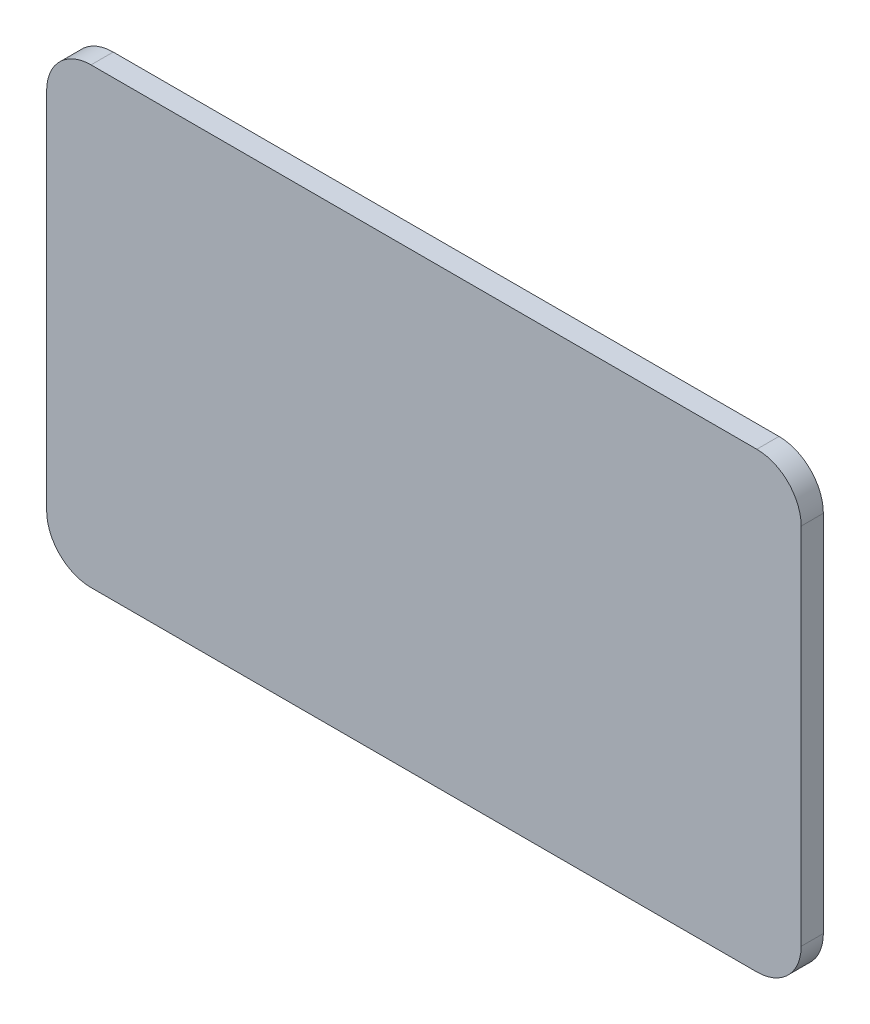
ISO-10303-21;
HEADER;
FILE_DESCRIPTION(('STEP AP214'),'2;1');
FILE_NAME('part.step','',(''),(''),'','','');
FILE_SCHEMA(('AUTOMOTIVE_DESIGN { 1 0 10303 214 1 1 1 1 }'));
ENDSEC;
DATA;
#1=APPLICATION_CONTEXT('core data for automotive mechanical design processes');
#2=APPLICATION_PROTOCOL_DEFINITION('international standard','automotive_design',2000,#1);
#3=PRODUCT_CONTEXT('',#1,'mechanical');
#4=PRODUCT('Part','Part','',(#3));
#5=PRODUCT_RELATED_PRODUCT_CATEGORY('part','',(#4));
#6=PRODUCT_DEFINITION_FORMATION('','',#4);
#7=PRODUCT_DEFINITION_CONTEXT('part definition',#1,'design');
#8=PRODUCT_DEFINITION('design','',#6,#7);
#9=PRODUCT_DEFINITION_SHAPE('','',#8);
#10=(LENGTH_UNIT() NAMED_UNIT(*) SI_UNIT(.MILLI.,.METRE.));
#11=(NAMED_UNIT(*) PLANE_ANGLE_UNIT() SI_UNIT($,.RADIAN.));
#12=(NAMED_UNIT(*) SI_UNIT($,.STERADIAN.) SOLID_ANGLE_UNIT());
#13=UNCERTAINTY_MEASURE_WITH_UNIT(LENGTH_MEASURE(1.E-05),#10,'distance_accuracy_value','');
#14=(GEOMETRIC_REPRESENTATION_CONTEXT(3) GLOBAL_UNCERTAINTY_ASSIGNED_CONTEXT((#13)) GLOBAL_UNIT_ASSIGNED_CONTEXT((#10,
#11,#12)) REPRESENTATION_CONTEXT('',''));
#15=CARTESIAN_POINT('',(0.,0.,0.));
#16=DIRECTION('',(0.,0.,1.));
#17=DIRECTION('',(1.,0.,0.));
#18=AXIS2_PLACEMENT_3D('',#15,#16,#17);
#19=CARTESIAN_POINT('',(10.,10.,5.));
#20=DIRECTION('',(0.,0.,-1.));
#21=DIRECTION('',(-1.,0.,0.));
#22=AXIS2_PLACEMENT_3D('',#19,#20,#21);
#23=CYLINDRICAL_SURFACE('',#22,10.);
#24=CARTESIAN_POINT('',(10.,10.,0.));
#25=DIRECTION('',(0.,0.,1.));
#26=DIRECTION('',(-1.,0.,0.));
#27=AXIS2_PLACEMENT_3D('',#24,#25,#26);
#28=CIRCLE('',#27,10.);
#29=CARTESIAN_POINT('',(0.,10.0000000000001,0.));
#30=VERTEX_POINT('',#29);
#31=CARTESIAN_POINT('',(10.0000000000001,0.,0.));
#32=VERTEX_POINT('',#31);
#33=EDGE_CURVE('E130',#30,#32,#28,.T.);
#34=ORIENTED_EDGE('',*,*,#33,.T.);
#35=DIRECTION('',(0.,0.,-1.));
#36=VECTOR('',#35,1.);
#37=CARTESIAN_POINT('',(10.0000000000001,0.,5.));
#38=LINE('',#37,#36);
#39=CARTESIAN_POINT('',(10.0000000000001,0.,5.));
#40=VERTEX_POINT('',#39);
#41=EDGE_CURVE('E11',#40,#32,#38,.T.);
#42=ORIENTED_EDGE('',*,*,#41,.F.);
#43=CARTESIAN_POINT('',(10.,10.,5.));
#44=DIRECTION('',(0.,0.,1.));
#45=DIRECTION('',(-1.,0.,0.));
#46=AXIS2_PLACEMENT_3D('',#43,#44,#45);
#47=CIRCLE('',#46,10.);
#48=CARTESIAN_POINT('',(0.,10.0000000000001,5.));
#49=VERTEX_POINT('',#48);
#50=EDGE_CURVE('E144',#49,#40,#47,.T.);
#51=ORIENTED_EDGE('',*,*,#50,.F.);
#52=DIRECTION('',(0.,0.,-1.));
#53=VECTOR('',#52,1.);
#54=CARTESIAN_POINT('',(0.,10.0000000000001,5.));
#55=LINE('',#54,#53);
#56=EDGE_CURVE('E126',#49,#30,#55,.T.);
#57=ORIENTED_EDGE('',*,*,#56,.T.);
#58=EDGE_LOOP('',(#34,#42,#51,#57));
#59=FACE_BOUND('',#58,.T.);
#60=ADVANCED_FACE('F34',(#59),#23,.T.);
#61=CARTESIAN_POINT('',(10.0000000000001,0.,5.));
#62=DIRECTION('',(0.,1.,0.));
#63=DIRECTION('',(0.,0.,1.));
#64=AXIS2_PLACEMENT_3D('',#61,#62,#63);
#65=PLANE('',#64);
#66=DIRECTION('',(1.,0.,0.));
#67=VECTOR('',#66,1.);
#68=CARTESIAN_POINT('',(10.0000000000001,0.,0.));
#69=LINE('',#68,#67);
#70=CARTESIAN_POINT('',(160.,0.,0.));
#71=VERTEX_POINT('',#70);
#72=EDGE_CURVE('E133',#32,#71,#69,.T.);
#73=ORIENTED_EDGE('',*,*,#72,.T.);
#74=DIRECTION('',(0.,0.,-1.));
#75=VECTOR('',#74,1.);
#76=CARTESIAN_POINT('',(160.,0.,5.));
#77=LINE('',#76,#75);
#78=CARTESIAN_POINT('',(160.,0.,5.));
#79=VERTEX_POINT('',#78);
#80=EDGE_CURVE('E42',#79,#71,#77,.T.);
#81=ORIENTED_EDGE('',*,*,#80,.F.);
#82=DIRECTION('',(1.,0.,0.));
#83=VECTOR('',#82,1.);
#84=CARTESIAN_POINT('',(10.0000000000001,0.,5.));
#85=LINE('',#84,#83);
#86=EDGE_CURVE('E93',#40,#79,#85,.T.);
#87=ORIENTED_EDGE('',*,*,#86,.F.);
#88=ORIENTED_EDGE('',*,*,#41,.T.);
#89=EDGE_LOOP('',(#73,#81,#87,#88));
#90=FACE_BOUND('',#89,.T.);
#91=ADVANCED_FACE('F179',(#90),#65,.F.);
#92=CARTESIAN_POINT('',(160.,10.,5.));
#93=DIRECTION('',(0.,0.,-1.));
#94=DIRECTION('',(-1.,0.,0.));
#95=AXIS2_PLACEMENT_3D('',#92,#93,#94);
#96=CYLINDRICAL_SURFACE('',#95,10.);
#97=CARTESIAN_POINT('',(160.,10.,0.));
#98=DIRECTION('',(0.,0.,1.));
#99=DIRECTION('',(1.,0.,0.));
#100=AXIS2_PLACEMENT_3D('',#97,#98,#99);
#101=CIRCLE('',#100,10.);
#102=CARTESIAN_POINT('',(170.,10.,0.));
#103=VERTEX_POINT('',#102);
#104=EDGE_CURVE('E135',#71,#103,#101,.T.);
#105=ORIENTED_EDGE('',*,*,#104,.T.);
#106=DIRECTION('',(0.,0.,-1.));
#107=VECTOR('',#106,1.);
#108=CARTESIAN_POINT('',(170.,10.,5.));
#109=LINE('',#108,#107);
#110=CARTESIAN_POINT('',(170.,10.,5.));
#111=VERTEX_POINT('',#110);
#112=EDGE_CURVE('E151',#111,#103,#109,.T.);
#113=ORIENTED_EDGE('',*,*,#112,.F.);
#114=CARTESIAN_POINT('',(160.,10.,5.));
#115=DIRECTION('',(0.,0.,1.));
#116=DIRECTION('',(1.,0.,0.));
#117=AXIS2_PLACEMENT_3D('',#114,#115,#116);
#118=CIRCLE('',#117,10.);
#119=EDGE_CURVE('E159',#79,#111,#118,.T.);
#120=ORIENTED_EDGE('',*,*,#119,.F.);
#121=ORIENTED_EDGE('',*,*,#80,.T.);
#122=EDGE_LOOP('',(#105,#113,#120,#121));
#123=FACE_BOUND('',#122,.T.);
#124=ADVANCED_FACE('F157',(#123),#96,.T.);
#125=CARTESIAN_POINT('',(170.,10.,5.));
#126=DIRECTION('',(-1.,0.,0.));
#127=DIRECTION('',(0.,0.,1.));
#128=AXIS2_PLACEMENT_3D('',#125,#126,#127);
#129=PLANE('',#128);
#130=DIRECTION('',(0.,1.,0.));
#131=VECTOR('',#130,1.);
#132=CARTESIAN_POINT('',(170.,10.,0.));
#133=LINE('',#132,#131);
#134=CARTESIAN_POINT('',(170.,92.,0.));
#135=VERTEX_POINT('',#134);
#136=EDGE_CURVE('E137',#103,#135,#133,.T.);
#137=ORIENTED_EDGE('',*,*,#136,.T.);
#138=DIRECTION('',(0.,0.,-1.));
#139=VECTOR('',#138,1.);
#140=CARTESIAN_POINT('',(170.,92.,5.));
#141=LINE('',#140,#139);
#142=CARTESIAN_POINT('',(170.,92.,5.));
#143=VERTEX_POINT('',#142);
#144=EDGE_CURVE('E148',#143,#135,#141,.T.);
#145=ORIENTED_EDGE('',*,*,#144,.F.);
#146=DIRECTION('',(0.,1.,0.));
#147=VECTOR('',#146,1.);
#148=CARTESIAN_POINT('',(170.,10.,5.));
#149=LINE('',#148,#147);
#150=EDGE_CURVE('E171',#111,#143,#149,.T.);
#151=ORIENTED_EDGE('',*,*,#150,.F.);
#152=ORIENTED_EDGE('',*,*,#112,.T.);
#153=EDGE_LOOP('',(#137,#145,#151,#152));
#154=FACE_BOUND('',#153,.T.);
#155=ADVANCED_FACE('F167',(#154),#129,.F.);
#156=CARTESIAN_POINT('',(160.,92.,5.));
#157=DIRECTION('',(0.,0.,-1.));
#158=DIRECTION('',(-1.,0.,0.));
#159=AXIS2_PLACEMENT_3D('',#156,#157,#158);
#160=CYLINDRICAL_SURFACE('',#159,10.);
#161=CARTESIAN_POINT('',(160.,92.,0.));
#162=DIRECTION('',(0.,0.,1.));
#163=DIRECTION('',(-1.,0.,0.));
#164=AXIS2_PLACEMENT_3D('',#161,#162,#163);
#165=CIRCLE('',#164,10.);
#166=CARTESIAN_POINT('',(160.,102.,0.));
#167=VERTEX_POINT('',#166);
#168=EDGE_CURVE('E139',#135,#167,#165,.T.);
#169=ORIENTED_EDGE('',*,*,#168,.T.);
#170=DIRECTION('',(0.,0.,-1.));
#171=VECTOR('',#170,1.);
#172=CARTESIAN_POINT('',(160.,102.,5.));
#173=LINE('',#172,#171);
#174=CARTESIAN_POINT('',(160.,102.,5.));
#175=VERTEX_POINT('',#174);
#176=EDGE_CURVE('E121',#175,#167,#173,.T.);
#177=ORIENTED_EDGE('',*,*,#176,.F.);
#178=CARTESIAN_POINT('',(160.,92.,5.));
#179=DIRECTION('',(0.,0.,1.));
#180=DIRECTION('',(-1.,0.,0.));
#181=AXIS2_PLACEMENT_3D('',#178,#179,#180);
#182=CIRCLE('',#181,10.);
#183=EDGE_CURVE('E112',#143,#175,#182,.T.);
#184=ORIENTED_EDGE('',*,*,#183,.F.);
#185=ORIENTED_EDGE('',*,*,#144,.T.);
#186=EDGE_LOOP('',(#169,#177,#184,#185));
#187=FACE_BOUND('',#186,.T.);
#188=ADVANCED_FACE('F170',(#187),#160,.T.);
#189=CARTESIAN_POINT('',(10.0000000000001,102.,5.));
#190=DIRECTION('',(0.,-1.,0.));
#191=DIRECTION('',(0.,0.,-1.));
#192=AXIS2_PLACEMENT_3D('',#189,#190,#191);
#193=PLANE('',#192);
#194=DIRECTION('',(-1.,0.,0.));
#195=VECTOR('',#194,1.);
#196=CARTESIAN_POINT('',(10.0000000000001,102.,0.));
#197=LINE('',#196,#195);
#198=CARTESIAN_POINT('',(10.0000000000001,102.,0.));
#199=VERTEX_POINT('',#198);
#200=EDGE_CURVE('E120',#167,#199,#197,.T.);
#201=ORIENTED_EDGE('',*,*,#200,.T.);
#202=DIRECTION('',(0.,0.,-1.));
#203=VECTOR('',#202,1.);
#204=CARTESIAN_POINT('',(10.0000000000001,102.,5.));
#205=LINE('',#204,#203);
#206=CARTESIAN_POINT('',(10.0000000000001,102.,5.));
#207=VERTEX_POINT('',#206);
#208=EDGE_CURVE('E117',#207,#199,#205,.T.);
#209=ORIENTED_EDGE('',*,*,#208,.F.);
#210=DIRECTION('',(-1.,0.,0.));
#211=VECTOR('',#210,1.);
#212=CARTESIAN_POINT('',(10.0000000000001,102.,5.));
#213=LINE('',#212,#211);
#214=EDGE_CURVE('E106',#175,#207,#213,.T.);
#215=ORIENTED_EDGE('',*,*,#214,.F.);
#216=ORIENTED_EDGE('',*,*,#176,.T.);
#217=EDGE_LOOP('',(#201,#209,#215,#216));
#218=FACE_BOUND('',#217,.T.);
#219=ADVANCED_FACE('F118',(#218),#193,.F.);
#220=CARTESIAN_POINT('',(10.,92.,5.));
#221=DIRECTION('',(0.,0.,-1.));
#222=DIRECTION('',(-1.,0.,0.));
#223=AXIS2_PLACEMENT_3D('',#220,#221,#222);
#224=CYLINDRICAL_SURFACE('',#223,10.);
#225=CARTESIAN_POINT('',(10.,92.,0.));
#226=DIRECTION('',(0.,0.,1.));
#227=DIRECTION('',(-1.,0.,0.));
#228=AXIS2_PLACEMENT_3D('',#225,#226,#227);
#229=CIRCLE('',#228,10.);
#230=CARTESIAN_POINT('',(0.,91.9999999999999,0.));
#231=VERTEX_POINT('',#230);
#232=EDGE_CURVE('E79',#199,#231,#229,.T.);
#233=ORIENTED_EDGE('',*,*,#232,.T.);
#234=DIRECTION('',(0.,0.,-1.));
#235=VECTOR('',#234,1.);
#236=CARTESIAN_POINT('',(0.,91.9999999999999,5.));
#237=LINE('',#236,#235);
#238=CARTESIAN_POINT('',(0.,91.9999999999999,5.));
#239=VERTEX_POINT('',#238);
#240=EDGE_CURVE('E122',#239,#231,#237,.T.);
#241=ORIENTED_EDGE('',*,*,#240,.F.);
#242=CARTESIAN_POINT('',(10.,92.,5.));
#243=DIRECTION('',(0.,0.,1.));
#244=DIRECTION('',(-1.,0.,0.));
#245=AXIS2_PLACEMENT_3D('',#242,#243,#244);
#246=CIRCLE('',#245,10.);
#247=EDGE_CURVE('E110',#207,#239,#246,.T.);
#248=ORIENTED_EDGE('',*,*,#247,.F.);
#249=ORIENTED_EDGE('',*,*,#208,.T.);
#250=EDGE_LOOP('',(#233,#241,#248,#249));
#251=FACE_BOUND('',#250,.T.);
#252=ADVANCED_FACE('F124',(#251),#224,.T.);
#253=CARTESIAN_POINT('',(0.,10.0000000000001,5.));
#254=DIRECTION('',(1.,0.,0.));
#255=DIRECTION('',(0.,0.,-1.));
#256=AXIS2_PLACEMENT_3D('',#253,#254,#255);
#257=PLANE('',#256);
#258=DIRECTION('',(0.,-1.,0.));
#259=VECTOR('',#258,1.);
#260=CARTESIAN_POINT('',(0.,10.0000000000001,0.));
#261=LINE('',#260,#259);
#262=EDGE_CURVE('E85',#231,#30,#261,.T.);
#263=ORIENTED_EDGE('',*,*,#262,.T.);
#264=ORIENTED_EDGE('',*,*,#56,.F.);
#265=DIRECTION('',(0.,-1.,0.));
#266=VECTOR('',#265,1.);
#267=CARTESIAN_POINT('',(0.,10.0000000000001,5.));
#268=LINE('',#267,#266);
#269=EDGE_CURVE('E50',#239,#49,#268,.T.);
#270=ORIENTED_EDGE('',*,*,#269,.F.);
#271=ORIENTED_EDGE('',*,*,#240,.T.);
#272=EDGE_LOOP('',(#263,#264,#270,#271));
#273=FACE_BOUND('',#272,.T.);
#274=ADVANCED_FACE('F195',(#273),#257,.F.);
#275=CARTESIAN_POINT('',(10.,10.,5.));
#276=DIRECTION('',(0.,0.,-1.));
#277=DIRECTION('',(-1.,0.,0.));
#278=AXIS2_PLACEMENT_3D('',#275,#276,#277);
#279=PLANE('',#278);
#280=ORIENTED_EDGE('',*,*,#50,.T.);
#281=ORIENTED_EDGE('',*,*,#86,.T.);
#282=ORIENTED_EDGE('',*,*,#119,.T.);
#283=ORIENTED_EDGE('',*,*,#150,.T.);
#284=ORIENTED_EDGE('',*,*,#183,.T.);
#285=ORIENTED_EDGE('',*,*,#214,.T.);
#286=ORIENTED_EDGE('',*,*,#247,.T.);
#287=ORIENTED_EDGE('',*,*,#269,.T.);
#288=EDGE_LOOP('',(#280,#281,#282,#283,#284,#285,#286,#287));
#289=FACE_BOUND('',#288,.T.);
#290=ADVANCED_FACE('F108',(#289),#279,.F.);
#291=CARTESIAN_POINT('',(10.,10.,0.));
#292=DIRECTION('',(0.,0.,-1.));
#293=DIRECTION('',(-1.,0.,0.));
#294=AXIS2_PLACEMENT_3D('',#291,#292,#293);
#295=PLANE('',#294);
#296=ORIENTED_EDGE('',*,*,#33,.F.);
#297=ORIENTED_EDGE('',*,*,#262,.F.);
#298=ORIENTED_EDGE('',*,*,#232,.F.);
#299=ORIENTED_EDGE('',*,*,#200,.F.);
#300=ORIENTED_EDGE('',*,*,#168,.F.);
#301=ORIENTED_EDGE('',*,*,#136,.F.);
#302=ORIENTED_EDGE('',*,*,#104,.F.);
#303=ORIENTED_EDGE('',*,*,#72,.F.);
#304=EDGE_LOOP('',(#296,#297,#298,#299,#300,#301,#302,#303));
#305=FACE_BOUND('',#304,.T.);
#306=ADVANCED_FACE('F163',(#305),#295,.T.);
#307=CLOSED_SHELL('',(#60,#91,#124,#155,#188,#219,#252,#274,#290,#306));
#308=MANIFOLD_SOLID_BREP('B2',#307);
#309=ADVANCED_BREP_SHAPE_REPRESENTATION('',(#18,#308),#14);
#310=SHAPE_DEFINITION_REPRESENTATION(#9,#309);
ENDSEC;
END-ISO-10303-21;
